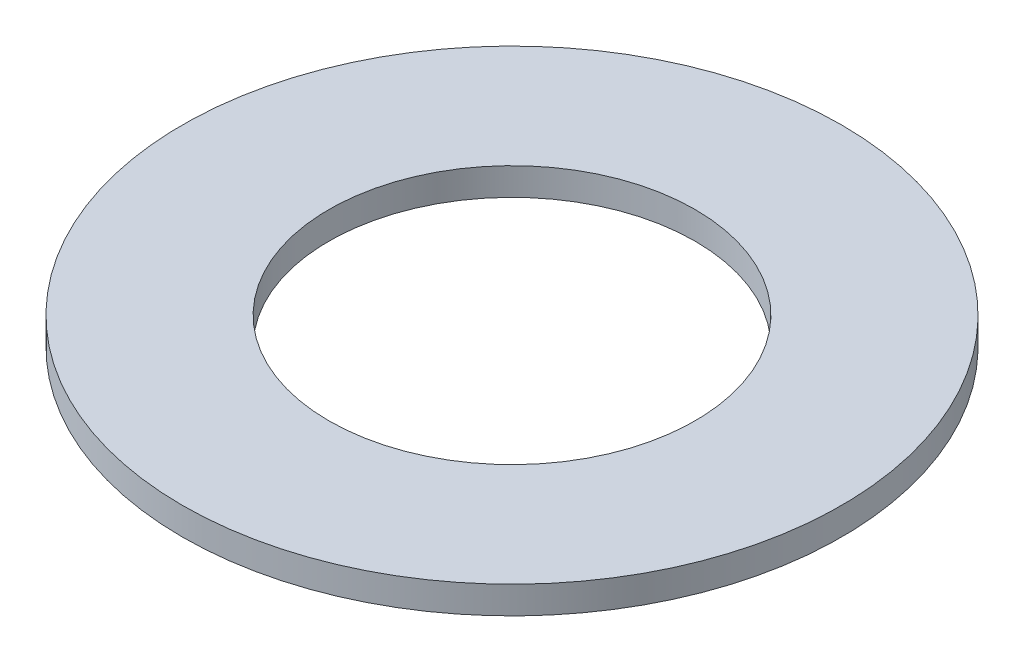
ISO-10303-21;
HEADER;
FILE_DESCRIPTION(('STEP AP214'),'2;1');
FILE_NAME('part.step','',(''),(''),'','','');
FILE_SCHEMA(('AUTOMOTIVE_DESIGN { 1 0 10303 214 1 1 1 1 }'));
ENDSEC;
DATA;
#1=APPLICATION_CONTEXT('core data for automotive mechanical design processes');
#2=APPLICATION_PROTOCOL_DEFINITION('international standard','automotive_design',2000,#1);
#3=PRODUCT_CONTEXT('',#1,'mechanical');
#4=PRODUCT('Part','Part','',(#3));
#5=PRODUCT_RELATED_PRODUCT_CATEGORY('part','',(#4));
#6=PRODUCT_DEFINITION_FORMATION('','',#4);
#7=PRODUCT_DEFINITION_CONTEXT('part definition',#1,'design');
#8=PRODUCT_DEFINITION('design','',#6,#7);
#9=PRODUCT_DEFINITION_SHAPE('','',#8);
#10=(LENGTH_UNIT() NAMED_UNIT(*) SI_UNIT(.MILLI.,.METRE.));
#11=(NAMED_UNIT(*) PLANE_ANGLE_UNIT() SI_UNIT($,.RADIAN.));
#12=(NAMED_UNIT(*) SI_UNIT($,.STERADIAN.) SOLID_ANGLE_UNIT());
#13=UNCERTAINTY_MEASURE_WITH_UNIT(LENGTH_MEASURE(1.E-05),#10,'distance_accuracy_value','');
#14=(GEOMETRIC_REPRESENTATION_CONTEXT(3) GLOBAL_UNCERTAINTY_ASSIGNED_CONTEXT((#13)) GLOBAL_UNIT_ASSIGNED_CONTEXT((#10,
#11,#12)) REPRESENTATION_CONTEXT('',''));
#15=CARTESIAN_POINT('',(0.,0.,0.));
#16=DIRECTION('',(0.,0.,1.));
#17=DIRECTION('',(1.,0.,0.));
#18=AXIS2_PLACEMENT_3D('',#15,#16,#17);
#19=CARTESIAN_POINT('',(0.,3.,0.));
#20=DIRECTION('',(0.,1.,0.));
#21=DIRECTION('',(0.,0.,1.));
#22=AXIS2_PLACEMENT_3D('',#19,#20,#21);
#23=PLANE('',#22);
#24=CARTESIAN_POINT('',(0.,3.,0.));
#25=DIRECTION('',(0.,1.,0.));
#26=DIRECTION('',(0.,0.,1.));
#27=AXIS2_PLACEMENT_3D('',#24,#25,#26);
#28=CIRCLE('',#27,36.);
#29=CARTESIAN_POINT('',(0.,3.,36.));
#30=VERTEX_POINT('',#29);
#31=EDGE_CURVE('E10',#30,#30,#28,.T.);
#32=ORIENTED_EDGE('',*,*,#31,.T.);
#33=EDGE_LOOP('',(#32));
#34=FACE_BOUND('',#33,.T.);
#35=CARTESIAN_POINT('',(0.,3.,0.));
#36=DIRECTION('',(0.,1.,0.));
#37=DIRECTION('',(0.,0.,1.));
#38=AXIS2_PLACEMENT_3D('',#35,#36,#37);
#39=CIRCLE('',#38,20.);
#40=CARTESIAN_POINT('',(0.,3.,20.));
#41=VERTEX_POINT('',#40);
#42=EDGE_CURVE('E42',#41,#41,#39,.T.);
#43=ORIENTED_EDGE('',*,*,#42,.F.);
#44=EDGE_LOOP('',(#43));
#45=FACE_BOUND('',#44,.T.);
#46=ADVANCED_FACE('F31',(#34,#45),#23,.T.);
#47=CARTESIAN_POINT('',(0.,0.,0.));
#48=DIRECTION('',(0.,1.,0.));
#49=DIRECTION('',(0.,0.,1.));
#50=AXIS2_PLACEMENT_3D('',#47,#48,#49);
#51=PLANE('',#50);
#52=CARTESIAN_POINT('',(0.,0.,0.));
#53=DIRECTION('',(0.,1.,0.));
#54=DIRECTION('',(0.,0.,1.));
#55=AXIS2_PLACEMENT_3D('',#52,#53,#54);
#56=CIRCLE('',#55,36.);
#57=CARTESIAN_POINT('',(0.,0.,36.));
#58=VERTEX_POINT('',#57);
#59=EDGE_CURVE('E35',#58,#58,#56,.T.);
#60=ORIENTED_EDGE('',*,*,#59,.F.);
#61=EDGE_LOOP('',(#60));
#62=FACE_BOUND('',#61,.T.);
#63=CARTESIAN_POINT('',(0.,0.,0.));
#64=DIRECTION('',(0.,1.,0.));
#65=DIRECTION('',(0.,0.,1.));
#66=AXIS2_PLACEMENT_3D('',#63,#64,#65);
#67=CIRCLE('',#66,20.);
#68=CARTESIAN_POINT('',(0.,0.,20.));
#69=VERTEX_POINT('',#68);
#70=EDGE_CURVE('E44',#69,#69,#67,.T.);
#71=ORIENTED_EDGE('',*,*,#70,.T.);
#72=EDGE_LOOP('',(#71));
#73=FACE_BOUND('',#72,.T.);
#74=ADVANCED_FACE('F54',(#62,#73),#51,.F.);
#75=CARTESIAN_POINT('',(0.,3.,0.));
#76=DIRECTION('',(0.,-1.,0.));
#77=DIRECTION('',(0.,0.,-1.));
#78=AXIS2_PLACEMENT_3D('',#75,#76,#77);
#79=CYLINDRICAL_SURFACE('',#78,36.);
#80=ORIENTED_EDGE('',*,*,#31,.F.);
#81=EDGE_LOOP('',(#80));
#82=FACE_BOUND('',#81,.T.);
#83=ORIENTED_EDGE('',*,*,#59,.T.);
#84=EDGE_LOOP('',(#83));
#85=FACE_BOUND('',#84,.T.);
#86=ADVANCED_FACE('F33',(#82,#85),#79,.T.);
#87=CARTESIAN_POINT('',(0.,3.,0.));
#88=DIRECTION('',(0.,-1.,0.));
#89=DIRECTION('',(0.,0.,-1.));
#90=AXIS2_PLACEMENT_3D('',#87,#88,#89);
#91=CYLINDRICAL_SURFACE('',#90,20.);
#92=ORIENTED_EDGE('',*,*,#42,.T.);
#93=EDGE_LOOP('',(#92));
#94=FACE_BOUND('',#93,.T.);
#95=ORIENTED_EDGE('',*,*,#70,.F.);
#96=EDGE_LOOP('',(#95));
#97=FACE_BOUND('',#96,.T.);
#98=ADVANCED_FACE('F50',(#94,#97),#91,.F.);
#99=CLOSED_SHELL('',(#46,#74,#86,#98));
#100=MANIFOLD_SOLID_BREP('B2',#99);
#101=ADVANCED_BREP_SHAPE_REPRESENTATION('',(#18,#100),#14);
#102=SHAPE_DEFINITION_REPRESENTATION(#9,#101);
ENDSEC;
END-ISO-10303-21;
